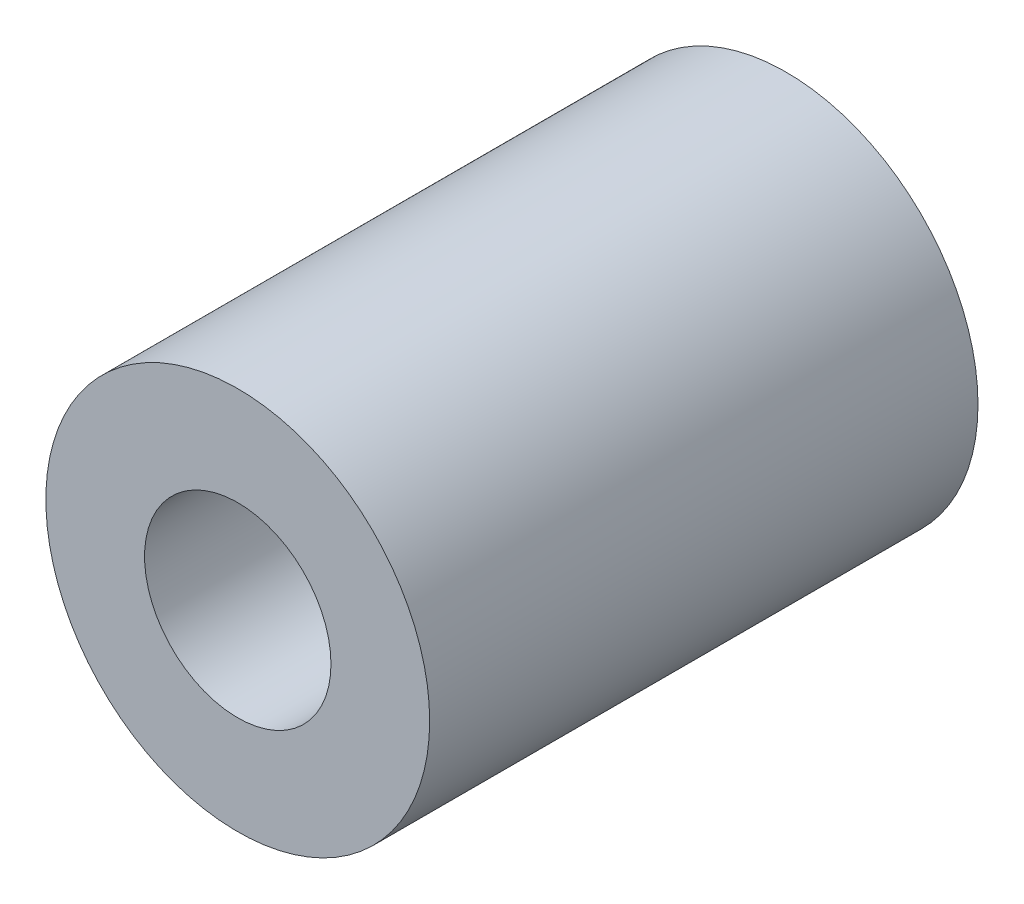
ISO-10303-21;
HEADER;
FILE_DESCRIPTION(('STEP AP214'),'2;1');
FILE_NAME('part.step','',(''),(''),'','','');
FILE_SCHEMA(('AUTOMOTIVE_DESIGN { 1 0 10303 214 1 1 1 1 }'));
ENDSEC;
DATA;
#1=APPLICATION_CONTEXT('core data for automotive mechanical design processes');
#2=APPLICATION_PROTOCOL_DEFINITION('international standard','automotive_design',2000,#1);
#3=PRODUCT_CONTEXT('',#1,'mechanical');
#4=PRODUCT('Part','Part','',(#3));
#5=PRODUCT_RELATED_PRODUCT_CATEGORY('part','',(#4));
#6=PRODUCT_DEFINITION_FORMATION('','',#4);
#7=PRODUCT_DEFINITION_CONTEXT('part definition',#1,'design');
#8=PRODUCT_DEFINITION('design','',#6,#7);
#9=PRODUCT_DEFINITION_SHAPE('','',#8);
#10=(LENGTH_UNIT() NAMED_UNIT(*) SI_UNIT(.MILLI.,.METRE.));
#11=(NAMED_UNIT(*) PLANE_ANGLE_UNIT() SI_UNIT($,.RADIAN.));
#12=(NAMED_UNIT(*) SI_UNIT($,.STERADIAN.) SOLID_ANGLE_UNIT());
#13=UNCERTAINTY_MEASURE_WITH_UNIT(LENGTH_MEASURE(1.E-05),#10,'distance_accuracy_value','');
#14=(GEOMETRIC_REPRESENTATION_CONTEXT(3) GLOBAL_UNCERTAINTY_ASSIGNED_CONTEXT((#13)) GLOBAL_UNIT_ASSIGNED_CONTEXT((#10,
#11,#12)) REPRESENTATION_CONTEXT('',''));
#15=CARTESIAN_POINT('',(0.,0.,0.));
#16=DIRECTION('',(0.,0.,1.));
#17=DIRECTION('',(1.,0.,0.));
#18=AXIS2_PLACEMENT_3D('',#15,#16,#17);
#19=CARTESIAN_POINT('',(-45.,-161.5,219.4));
#20=DIRECTION('',(0.,0.,1.));
#21=DIRECTION('',(1.,0.,0.));
#22=AXIS2_PLACEMENT_3D('',#19,#20,#21);
#23=CYLINDRICAL_SURFACE('',#22,1.7);
#24=DIRECTION('',(0.,0.,1.));
#25=VECTOR('',#24,1.);
#26=CARTESIAN_POINT('',(-43.3,-161.5,219.4));
#27=LINE('',#26,#25);
#28=CARTESIAN_POINT('',(-43.3,-161.5,219.5));
#29=VERTEX_POINT('',#28);
#30=CARTESIAN_POINT('',(-43.3,-161.5,229.5));
#31=VERTEX_POINT('',#30);
#32=EDGE_CURVE('E9',#29,#31,#27,.T.);
#33=ORIENTED_EDGE('',*,*,#32,.F.);
#34=CARTESIAN_POINT('',(-45.,-161.5,219.5));
#35=DIRECTION('',(0.,0.,1.));
#36=DIRECTION('',(1.,0.,0.));
#37=AXIS2_PLACEMENT_3D('',#34,#35,#36);
#38=CIRCLE('',#37,1.7);
#39=EDGE_CURVE('E24',#29,#29,#38,.T.);
#40=ORIENTED_EDGE('',*,*,#39,.F.);
#41=ORIENTED_EDGE('',*,*,#32,.T.);
#42=CARTESIAN_POINT('',(-45.,-161.5,229.5));
#43=DIRECTION('',(0.,0.,1.));
#44=DIRECTION('',(1.,0.,0.));
#45=AXIS2_PLACEMENT_3D('',#42,#43,#44);
#46=CIRCLE('',#45,1.7);
#47=EDGE_CURVE('E56',#31,#31,#46,.T.);
#48=ORIENTED_EDGE('',*,*,#47,.T.);
#49=EDGE_LOOP('',(#33,#40,#41,#48));
#50=FACE_BOUND('',#49,.T.);
#51=ADVANCED_FACE('F14',(#50),#23,.F.);
#52=CARTESIAN_POINT('',(-45.,-161.5,219.5));
#53=DIRECTION('',(0.,0.,1.));
#54=DIRECTION('',(1.,0.,0.));
#55=AXIS2_PLACEMENT_3D('',#52,#53,#54);
#56=PLANE('',#55);
#57=ORIENTED_EDGE('',*,*,#39,.T.);
#58=EDGE_LOOP('',(#57));
#59=FACE_BOUND('',#58,.T.);
#60=CARTESIAN_POINT('',(-45.,-161.5,219.5));
#61=DIRECTION('',(0.,0.,1.));
#62=DIRECTION('',(1.,0.,0.));
#63=AXIS2_PLACEMENT_3D('',#60,#61,#62);
#64=CIRCLE('',#63,3.5);
#65=CARTESIAN_POINT('',(-41.5,-161.5,219.5));
#66=VERTEX_POINT('',#65);
#67=EDGE_CURVE('E52',#66,#66,#64,.T.);
#68=ORIENTED_EDGE('',*,*,#67,.F.);
#69=EDGE_LOOP('',(#68));
#70=FACE_BOUND('',#69,.T.);
#71=ADVANCED_FACE('F68',(#59,#70),#56,.F.);
#72=CARTESIAN_POINT('',(-45.,-161.5,229.5));
#73=DIRECTION('',(0.,0.,1.));
#74=DIRECTION('',(1.,0.,0.));
#75=AXIS2_PLACEMENT_3D('',#72,#73,#74);
#76=PLANE('',#75);
#77=ORIENTED_EDGE('',*,*,#47,.F.);
#78=EDGE_LOOP('',(#77));
#79=FACE_BOUND('',#78,.T.);
#80=CARTESIAN_POINT('',(-45.,-161.5,229.5));
#81=DIRECTION('',(0.,0.,1.));
#82=DIRECTION('',(1.,0.,0.));
#83=AXIS2_PLACEMENT_3D('',#80,#81,#82);
#84=CIRCLE('',#83,3.5);
#85=CARTESIAN_POINT('',(-41.5,-161.5,229.5));
#86=VERTEX_POINT('',#85);
#87=EDGE_CURVE('E63',#86,#86,#84,.T.);
#88=ORIENTED_EDGE('',*,*,#87,.T.);
#89=EDGE_LOOP('',(#88));
#90=FACE_BOUND('',#89,.T.);
#91=ADVANCED_FACE('F66',(#79,#90),#76,.T.);
#92=CARTESIAN_POINT('',(-45.,-161.5,219.5));
#93=DIRECTION('',(0.,0.,1.));
#94=DIRECTION('',(1.,0.,0.));
#95=AXIS2_PLACEMENT_3D('',#92,#93,#94);
#96=CYLINDRICAL_SURFACE('',#95,3.5);
#97=ORIENTED_EDGE('',*,*,#87,.F.);
#98=DIRECTION('',(0.,0.,1.));
#99=VECTOR('',#98,1.);
#100=CARTESIAN_POINT('',(-41.5,-161.5,219.5));
#101=LINE('',#100,#99);
#102=EDGE_CURVE('E17',#66,#86,#101,.T.);
#103=ORIENTED_EDGE('',*,*,#102,.F.);
#104=ORIENTED_EDGE('',*,*,#67,.T.);
#105=ORIENTED_EDGE('',*,*,#102,.T.);
#106=EDGE_LOOP('',(#97,#103,#104,#105));
#107=FACE_BOUND('',#106,.T.);
#108=ADVANCED_FACE('F53',(#107),#96,.T.);
#109=CLOSED_SHELL('',(#51,#71,#91,#108));
#110=MANIFOLD_SOLID_BREP('B1',#109);
#111=ADVANCED_BREP_SHAPE_REPRESENTATION('',(#18,#110),#14);
#112=SHAPE_DEFINITION_REPRESENTATION(#9,#111);
ENDSEC;
END-ISO-10303-21;
